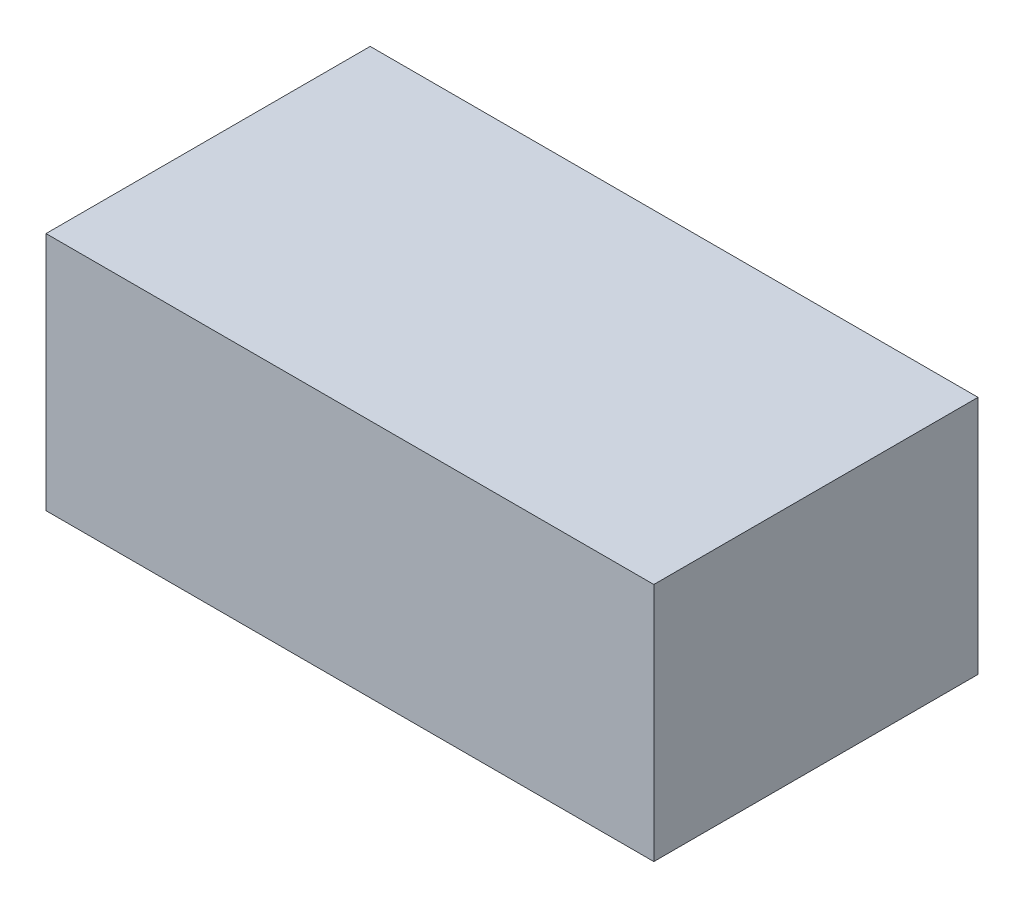
ISO-10303-21;
HEADER;
FILE_DESCRIPTION(('STEP AP214'),'2;1');
FILE_NAME('part.step','',(''),(''),'','','');
FILE_SCHEMA(('AUTOMOTIVE_DESIGN { 1 0 10303 214 1 1 1 1 }'));
ENDSEC;
DATA;
#1=APPLICATION_CONTEXT('core data for automotive mechanical design processes');
#2=APPLICATION_PROTOCOL_DEFINITION('international standard','automotive_design',2000,#1);
#3=PRODUCT_CONTEXT('',#1,'mechanical');
#4=PRODUCT('Part','Part','',(#3));
#5=PRODUCT_RELATED_PRODUCT_CATEGORY('part','',(#4));
#6=PRODUCT_DEFINITION_FORMATION('','',#4);
#7=PRODUCT_DEFINITION_CONTEXT('part definition',#1,'design');
#8=PRODUCT_DEFINITION('design','',#6,#7);
#9=PRODUCT_DEFINITION_SHAPE('','',#8);
#10=(LENGTH_UNIT() NAMED_UNIT(*) SI_UNIT(.MILLI.,.METRE.));
#11=(NAMED_UNIT(*) PLANE_ANGLE_UNIT() SI_UNIT($,.RADIAN.));
#12=(NAMED_UNIT(*) SI_UNIT($,.STERADIAN.) SOLID_ANGLE_UNIT());
#13=UNCERTAINTY_MEASURE_WITH_UNIT(LENGTH_MEASURE(1.E-05),#10,'distance_accuracy_value','');
#14=(GEOMETRIC_REPRESENTATION_CONTEXT(3) GLOBAL_UNCERTAINTY_ASSIGNED_CONTEXT((#13)) GLOBAL_UNIT_ASSIGNED_CONTEXT((#10,
#11,#12)) REPRESENTATION_CONTEXT('',''));
#15=CARTESIAN_POINT('',(0.,0.,0.));
#16=DIRECTION('',(0.,0.,1.));
#17=DIRECTION('',(1.,0.,0.));
#18=AXIS2_PLACEMENT_3D('',#15,#16,#17);
#19=CARTESIAN_POINT('',(15.,13.,8.));
#20=DIRECTION('',(-1.,0.,0.));
#21=DIRECTION('',(0.,0.,1.));
#22=AXIS2_PLACEMENT_3D('',#19,#20,#21);
#23=PLANE('',#22);
#24=DIRECTION('',(0.,-1.,0.));
#25=VECTOR('',#24,1.);
#26=CARTESIAN_POINT('',(15.,13.,8.));
#27=LINE('',#26,#25);
#28=CARTESIAN_POINT('',(15.,13.,8.));
#29=VERTEX_POINT('',#28);
#30=CARTESIAN_POINT('',(15.,1.15470053837926,8.));
#31=VERTEX_POINT('',#30);
#32=EDGE_CURVE('E157',#29,#31,#27,.T.);
#33=ORIENTED_EDGE('',*,*,#32,.T.);
#34=DIRECTION('',(0.,0.,-1.));
#35=VECTOR('',#34,1.);
#36=CARTESIAN_POINT('',(15.,1.15470053837926,-8.));
#37=LINE('',#36,#35);
#38=CARTESIAN_POINT('',(15.,1.15470053837926,-8.));
#39=VERTEX_POINT('',#38);
#40=EDGE_CURVE('E47',#31,#39,#37,.T.);
#41=ORIENTED_EDGE('',*,*,#40,.T.);
#42=DIRECTION('',(0.,-1.,0.));
#43=VECTOR('',#42,1.);
#44=CARTESIAN_POINT('',(15.,13.,-8.));
#45=LINE('',#44,#43);
#46=CARTESIAN_POINT('',(15.,13.,-8.));
#47=VERTEX_POINT('',#46);
#48=EDGE_CURVE('E95',#47,#39,#45,.T.);
#49=ORIENTED_EDGE('',*,*,#48,.F.);
#50=DIRECTION('',(0.,0.,-1.));
#51=VECTOR('',#50,1.);
#52=CARTESIAN_POINT('',(15.,13.,8.));
#53=LINE('',#52,#51);
#54=EDGE_CURVE('E102',#29,#47,#53,.T.);
#55=ORIENTED_EDGE('',*,*,#54,.F.);
#56=EDGE_LOOP('',(#33,#41,#49,#55));
#57=FACE_BOUND('',#56,.T.);
#58=ADVANCED_FACE('F37',(#57),#23,.F.);
#59=CARTESIAN_POINT('',(-15.,13.,-8.));
#60=DIRECTION('',(0.,0.,1.));
#61=DIRECTION('',(1.,0.,0.));
#62=AXIS2_PLACEMENT_3D('',#59,#60,#61);
#63=PLANE('',#62);
#64=ORIENTED_EDGE('',*,*,#48,.T.);
#65=DIRECTION('',(-1.,0.,0.));
#66=VECTOR('',#65,1.);
#67=CARTESIAN_POINT('',(-15.,1.15470053837926,-8.));
#68=LINE('',#67,#66);
#69=CARTESIAN_POINT('',(-15.,1.15470053837926,-8.));
#70=VERTEX_POINT('',#69);
#71=EDGE_CURVE('E126',#39,#70,#68,.T.);
#72=ORIENTED_EDGE('',*,*,#71,.T.);
#73=DIRECTION('',(0.,-1.,0.));
#74=VECTOR('',#73,1.);
#75=CARTESIAN_POINT('',(-15.,13.,-8.));
#76=LINE('',#75,#74);
#77=CARTESIAN_POINT('',(-15.,13.,-8.));
#78=VERTEX_POINT('',#77);
#79=EDGE_CURVE('E98',#78,#70,#76,.T.);
#80=ORIENTED_EDGE('',*,*,#79,.F.);
#81=DIRECTION('',(-1.,0.,0.));
#82=VECTOR('',#81,1.);
#83=CARTESIAN_POINT('',(-15.,13.,-8.));
#84=LINE('',#83,#82);
#85=EDGE_CURVE('E92',#47,#78,#84,.T.);
#86=ORIENTED_EDGE('',*,*,#85,.F.);
#87=EDGE_LOOP('',(#64,#72,#80,#86));
#88=FACE_BOUND('',#87,.T.);
#89=ADVANCED_FACE('F94',(#88),#63,.F.);
#90=CARTESIAN_POINT('',(-15.,13.,8.));
#91=DIRECTION('',(1.,0.,0.));
#92=DIRECTION('',(0.,0.,-1.));
#93=AXIS2_PLACEMENT_3D('',#90,#91,#92);
#94=PLANE('',#93);
#95=ORIENTED_EDGE('',*,*,#79,.T.);
#96=DIRECTION('',(0.,0.,1.));
#97=VECTOR('',#96,1.);
#98=CARTESIAN_POINT('',(-15.,1.15470053837926,8.));
#99=LINE('',#98,#97);
#100=CARTESIAN_POINT('',(-15.,1.15470053837926,8.));
#101=VERTEX_POINT('',#100);
#102=EDGE_CURVE('E109',#70,#101,#99,.T.);
#103=ORIENTED_EDGE('',*,*,#102,.T.);
#104=DIRECTION('',(0.,-1.,0.));
#105=VECTOR('',#104,1.);
#106=CARTESIAN_POINT('',(-15.,13.,8.));
#107=LINE('',#106,#105);
#108=CARTESIAN_POINT('',(-15.,13.,8.));
#109=VERTEX_POINT('',#108);
#110=EDGE_CURVE('E114',#109,#101,#107,.T.);
#111=ORIENTED_EDGE('',*,*,#110,.F.);
#112=DIRECTION('',(0.,0.,1.));
#113=VECTOR('',#112,1.);
#114=CARTESIAN_POINT('',(-15.,13.,8.));
#115=LINE('',#114,#113);
#116=EDGE_CURVE('E101',#78,#109,#115,.T.);
#117=ORIENTED_EDGE('',*,*,#116,.F.);
#118=EDGE_LOOP('',(#95,#103,#111,#117));
#119=FACE_BOUND('',#118,.T.);
#120=ADVANCED_FACE('F155',(#119),#94,.F.);
#121=CARTESIAN_POINT('',(-15.,13.,8.));
#122=DIRECTION('',(0.,0.,-1.));
#123=DIRECTION('',(-1.,0.,0.));
#124=AXIS2_PLACEMENT_3D('',#121,#122,#123);
#125=PLANE('',#124);
#126=ORIENTED_EDGE('',*,*,#110,.T.);
#127=DIRECTION('',(1.,0.,0.));
#128=VECTOR('',#127,1.);
#129=CARTESIAN_POINT('',(15.,1.15470053837926,8.));
#130=LINE('',#129,#128);
#131=EDGE_CURVE('E11',#101,#31,#130,.T.);
#132=ORIENTED_EDGE('',*,*,#131,.T.);
#133=ORIENTED_EDGE('',*,*,#32,.F.);
#134=DIRECTION('',(1.,0.,0.));
#135=VECTOR('',#134,1.);
#136=CARTESIAN_POINT('',(-15.,13.,8.));
#137=LINE('',#136,#135);
#138=EDGE_CURVE('E107',#109,#29,#137,.T.);
#139=ORIENTED_EDGE('',*,*,#138,.F.);
#140=EDGE_LOOP('',(#126,#132,#133,#139));
#141=FACE_BOUND('',#140,.T.);
#142=ADVANCED_FACE('F156',(#141),#125,.F.);
#143=CARTESIAN_POINT('',(0.,13.,0.));
#144=DIRECTION('',(0.,-1.,0.));
#145=DIRECTION('',(0.,0.,-1.));
#146=AXIS2_PLACEMENT_3D('',#143,#144,#145);
#147=PLANE('',#146);
#148=ORIENTED_EDGE('',*,*,#54,.T.);
#149=ORIENTED_EDGE('',*,*,#85,.T.);
#150=ORIENTED_EDGE('',*,*,#116,.T.);
#151=ORIENTED_EDGE('',*,*,#138,.T.);
#152=EDGE_LOOP('',(#148,#149,#150,#151));
#153=FACE_BOUND('',#152,.T.);
#154=ADVANCED_FACE('F105',(#153),#147,.F.);
#155=CARTESIAN_POINT('',(0.,0.,0.));
#156=DIRECTION('',(0.,-1.,0.));
#157=DIRECTION('',(0.,0.,-1.));
#158=AXIS2_PLACEMENT_3D('',#155,#156,#157);
#159=PLANE('',#158);
#160=DIRECTION('',(-1.,0.,0.));
#161=VECTOR('',#160,1.);
#162=CARTESIAN_POINT('',(-15.,0.,5.99999999999998));
#163=LINE('',#162,#161);
#164=CARTESIAN_POINT('',(13.,0.,5.99999999999998));
#165=VERTEX_POINT('',#164);
#166=CARTESIAN_POINT('',(-13.,0.,5.99999999999998));
#167=VERTEX_POINT('',#166);
#168=EDGE_CURVE('E112',#165,#167,#163,.T.);
#169=ORIENTED_EDGE('',*,*,#168,.T.);
#170=DIRECTION('',(0.,0.,-1.));
#171=VECTOR('',#170,1.);
#172=CARTESIAN_POINT('',(-13.,0.,-8.));
#173=LINE('',#172,#171);
#174=CARTESIAN_POINT('',(-13.,0.,-5.99999999999999));
#175=VERTEX_POINT('',#174);
#176=EDGE_CURVE('E123',#167,#175,#173,.T.);
#177=ORIENTED_EDGE('',*,*,#176,.T.);
#178=DIRECTION('',(1.,0.,0.));
#179=VECTOR('',#178,1.);
#180=CARTESIAN_POINT('',(15.,0.,-5.99999999999999));
#181=LINE('',#180,#179);
#182=CARTESIAN_POINT('',(13.,0.,-5.99999999999999));
#183=VERTEX_POINT('',#182);
#184=EDGE_CURVE('E121',#175,#183,#181,.T.);
#185=ORIENTED_EDGE('',*,*,#184,.T.);
#186=DIRECTION('',(0.,0.,1.));
#187=VECTOR('',#186,1.);
#188=CARTESIAN_POINT('',(13.,0.,8.));
#189=LINE('',#188,#187);
#190=EDGE_CURVE('E119',#183,#165,#189,.T.);
#191=ORIENTED_EDGE('',*,*,#190,.T.);
#192=EDGE_LOOP('',(#169,#177,#185,#191));
#193=FACE_BOUND('',#192,.T.);
#194=ADVANCED_FACE('F146',(#193),#159,.T.);
#195=CARTESIAN_POINT('',(15.,1.15470053837926,8.));
#196=DIRECTION('',(0.499999999999999,-0.866025403784439,0.));
#197=DIRECTION('',(0.,0.,1.));
#198=AXIS2_PLACEMENT_3D('',#195,#196,#197);
#199=PLANE('',#198);
#200=DIRECTION('',(0.654653670707977,0.377964473009226,0.654653670707978));
#201=VECTOR('',#200,1.);
#202=CARTESIAN_POINT('',(2.14285714285715,-6.26837435120162,-4.85714285714287));
#203=LINE('',#202,#201);
#204=EDGE_CURVE('E132',#165,#31,#203,.T.);
#205=ORIENTED_EDGE('',*,*,#204,.F.);
#206=ORIENTED_EDGE('',*,*,#190,.F.);
#207=DIRECTION('',(0.654653670707977,0.377964473009226,-0.654653670707978));
#208=VECTOR('',#207,1.);
#209=CARTESIAN_POINT('',(8.14285714285714,-2.80427273606388,-1.14285714285713));
#210=LINE('',#209,#208);
#211=EDGE_CURVE('E42',#39,#183,#210,.F.);
#212=ORIENTED_EDGE('',*,*,#211,.F.);
#213=ORIENTED_EDGE('',*,*,#40,.F.);
#214=EDGE_LOOP('',(#205,#206,#212,#213));
#215=FACE_BOUND('',#214,.T.);
#216=ADVANCED_FACE('F40',(#215),#199,.T.);
#217=CARTESIAN_POINT('',(-15.,1.15470053837926,-8.));
#218=DIRECTION('',(0.,-0.86602540378444,-0.499999999999999));
#219=DIRECTION('',(1.,0.,0.));
#220=AXIS2_PLACEMENT_3D('',#217,#218,#219);
#221=PLANE('',#220);
#222=ORIENTED_EDGE('',*,*,#211,.T.);
#223=ORIENTED_EDGE('',*,*,#184,.F.);
#224=DIRECTION('',(-0.654653670707977,0.377964473009226,-0.654653670707978));
#225=VECTOR('',#224,1.);
#226=CARTESIAN_POINT('',(-15.,1.15470053837926,-8.));
#227=LINE('',#226,#225);
#228=EDGE_CURVE('E131',#70,#175,#227,.F.);
#229=ORIENTED_EDGE('',*,*,#228,.F.);
#230=ORIENTED_EDGE('',*,*,#71,.F.);
#231=EDGE_LOOP('',(#222,#223,#229,#230));
#232=FACE_BOUND('',#231,.T.);
#233=ADVANCED_FACE('F141',(#232),#221,.T.);
#234=CARTESIAN_POINT('',(-15.,1.15470053837926,8.));
#235=DIRECTION('',(0.,-0.86602540378444,0.499999999999999));
#236=DIRECTION('',(-1.,0.,0.));
#237=AXIS2_PLACEMENT_3D('',#234,#235,#236);
#238=PLANE('',#237);
#239=ORIENTED_EDGE('',*,*,#204,.T.);
#240=ORIENTED_EDGE('',*,*,#131,.F.);
#241=DIRECTION('',(0.654653670707977,-0.377964473009226,-0.654653670707978));
#242=VECTOR('',#241,1.);
#243=CARTESIAN_POINT('',(-15.,1.15470053837926,8.));
#244=LINE('',#243,#242);
#245=EDGE_CURVE('E129',#167,#101,#244,.F.);
#246=ORIENTED_EDGE('',*,*,#245,.F.);
#247=ORIENTED_EDGE('',*,*,#168,.F.);
#248=EDGE_LOOP('',(#239,#240,#246,#247));
#249=FACE_BOUND('',#248,.T.);
#250=ADVANCED_FACE('F152',(#249),#238,.T.);
#251=CARTESIAN_POINT('',(-15.,1.15470053837926,8.));
#252=DIRECTION('',(-0.499999999999999,-0.866025403784439,0.));
#253=DIRECTION('',(0.,0.,-1.));
#254=AXIS2_PLACEMENT_3D('',#251,#252,#253);
#255=PLANE('',#254);
#256=ORIENTED_EDGE('',*,*,#228,.T.);
#257=ORIENTED_EDGE('',*,*,#176,.F.);
#258=ORIENTED_EDGE('',*,*,#245,.T.);
#259=ORIENTED_EDGE('',*,*,#102,.F.);
#260=EDGE_LOOP('',(#256,#257,#258,#259));
#261=FACE_BOUND('',#260,.T.);
#262=ADVANCED_FACE('F150',(#261),#255,.T.);
#263=CLOSED_SHELL('',(#58,#89,#120,#142,#154,#194,#216,#233,#250,#262));
#264=MANIFOLD_SOLID_BREP('B2',#263);
#265=ADVANCED_BREP_SHAPE_REPRESENTATION('',(#18,#264),#14);
#266=SHAPE_DEFINITION_REPRESENTATION(#9,#265);
ENDSEC;
END-ISO-10303-21;
